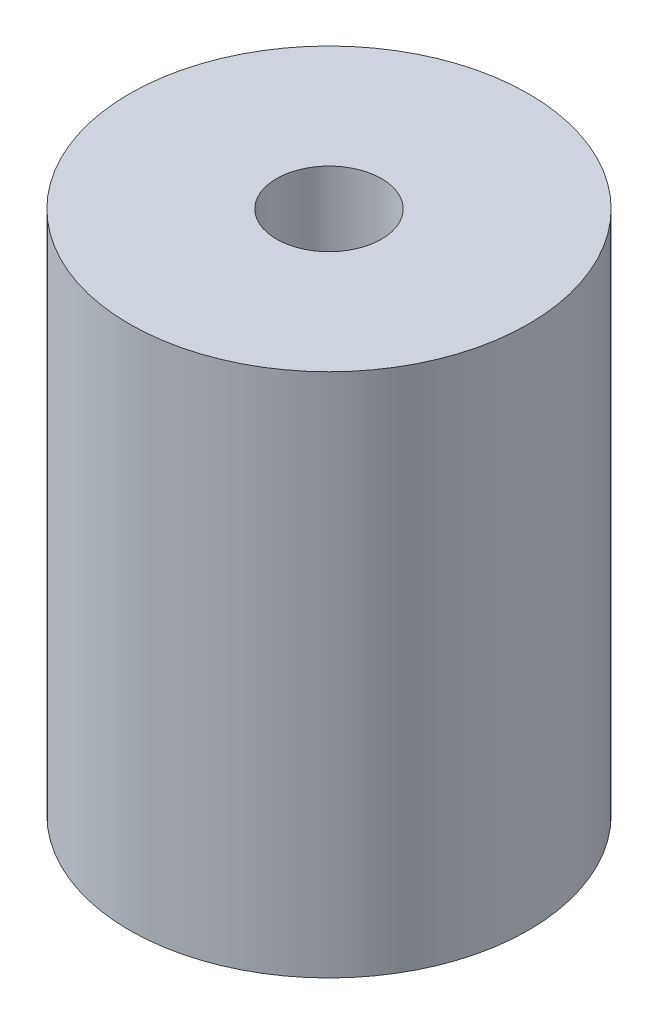
ISO-10303-21;
HEADER;
FILE_DESCRIPTION(('STEP AP214'),'2;1');
FILE_NAME('part.step','',(''),(''),'','','');
FILE_SCHEMA(('AUTOMOTIVE_DESIGN { 1 0 10303 214 1 1 1 1 }'));
ENDSEC;
DATA;
#1=APPLICATION_CONTEXT('core data for automotive mechanical design processes');
#2=APPLICATION_PROTOCOL_DEFINITION('international standard','automotive_design',2000,#1);
#3=PRODUCT_CONTEXT('',#1,'mechanical');
#4=PRODUCT('Part','Part','',(#3));
#5=PRODUCT_RELATED_PRODUCT_CATEGORY('part','',(#4));
#6=PRODUCT_DEFINITION_FORMATION('','',#4);
#7=PRODUCT_DEFINITION_CONTEXT('part definition',#1,'design');
#8=PRODUCT_DEFINITION('design','',#6,#7);
#9=PRODUCT_DEFINITION_SHAPE('','',#8);
#10=(LENGTH_UNIT() NAMED_UNIT(*) SI_UNIT(.MILLI.,.METRE.));
#11=(NAMED_UNIT(*) PLANE_ANGLE_UNIT() SI_UNIT($,.RADIAN.));
#12=(NAMED_UNIT(*) SI_UNIT($,.STERADIAN.) SOLID_ANGLE_UNIT());
#13=UNCERTAINTY_MEASURE_WITH_UNIT(LENGTH_MEASURE(1.E-05),#10,'distance_accuracy_value','');
#14=(GEOMETRIC_REPRESENTATION_CONTEXT(3) GLOBAL_UNCERTAINTY_ASSIGNED_CONTEXT((#13)) GLOBAL_UNIT_ASSIGNED_CONTEXT((#10,
#11,#12)) REPRESENTATION_CONTEXT('',''));
#15=CARTESIAN_POINT('',(0.,0.,0.));
#16=DIRECTION('',(0.,0.,1.));
#17=DIRECTION('',(1.,0.,0.));
#18=AXIS2_PLACEMENT_3D('',#15,#16,#17);
#19=CARTESIAN_POINT('',(9.5,0.,0.));
#20=DIRECTION('',(0.,-1.,0.));
#21=DIRECTION('',(0.,0.,-1.));
#22=AXIS2_PLACEMENT_3D('',#19,#20,#21);
#23=PLANE('',#22);
#24=CARTESIAN_POINT('',(0.,0.,0.));
#25=DIRECTION('',(0.,-1.,0.));
#26=DIRECTION('',(0.,0.,-1.));
#27=AXIS2_PLACEMENT_3D('',#24,#25,#26);
#28=CIRCLE('',#27,9.5);
#29=CARTESIAN_POINT('',(0.,0.,-9.5));
#30=VERTEX_POINT('',#29);
#31=EDGE_CURVE('E54',#30,#30,#28,.T.);
#32=ORIENTED_EDGE('',*,*,#31,.T.);
#33=EDGE_LOOP('',(#32));
#34=FACE_BOUND('',#33,.T.);
#35=CARTESIAN_POINT('',(0.,0.,0.));
#36=DIRECTION('',(0.,-1.,0.));
#37=DIRECTION('',(0.,0.,-1.));
#38=AXIS2_PLACEMENT_3D('',#35,#36,#37);
#39=CIRCLE('',#38,2.5);
#40=CARTESIAN_POINT('',(0.,0.,-2.5));
#41=VERTEX_POINT('',#40);
#42=EDGE_CURVE('E10',#41,#41,#39,.T.);
#43=ORIENTED_EDGE('',*,*,#42,.F.);
#44=EDGE_LOOP('',(#43));
#45=FACE_BOUND('',#44,.T.);
#46=ADVANCED_FACE('F37',(#34,#45),#23,.T.);
#47=CARTESIAN_POINT('',(0.,0.,0.));
#48=DIRECTION('',(0.,-1.,0.));
#49=DIRECTION('',(0.,0.,-1.));
#50=AXIS2_PLACEMENT_3D('',#47,#48,#49);
#51=CYLINDRICAL_SURFACE('',#50,2.5);
#52=ORIENTED_EDGE('',*,*,#42,.T.);
#53=EDGE_LOOP('',(#52));
#54=FACE_BOUND('',#53,.T.);
#55=CARTESIAN_POINT('',(0.,25.,0.));
#56=DIRECTION('',(0.,-1.,0.));
#57=DIRECTION('',(0.,0.,-1.));
#58=AXIS2_PLACEMENT_3D('',#55,#56,#57);
#59=CIRCLE('',#58,2.5);
#60=CARTESIAN_POINT('',(0.,25.,-2.5));
#61=VERTEX_POINT('',#60);
#62=EDGE_CURVE('E44',#61,#61,#59,.T.);
#63=ORIENTED_EDGE('',*,*,#62,.F.);
#64=EDGE_LOOP('',(#63));
#65=FACE_BOUND('',#64,.T.);
#66=ADVANCED_FACE('F71',(#54,#65),#51,.F.);
#67=CARTESIAN_POINT('',(2.5,25.,0.));
#68=DIRECTION('',(0.,1.,0.));
#69=DIRECTION('',(0.,0.,1.));
#70=AXIS2_PLACEMENT_3D('',#67,#68,#69);
#71=PLANE('',#70);
#72=ORIENTED_EDGE('',*,*,#62,.T.);
#73=EDGE_LOOP('',(#72));
#74=FACE_BOUND('',#73,.T.);
#75=CARTESIAN_POINT('',(0.,25.,0.));
#76=DIRECTION('',(0.,-1.,0.));
#77=DIRECTION('',(0.,0.,-1.));
#78=AXIS2_PLACEMENT_3D('',#75,#76,#77);
#79=CIRCLE('',#78,9.5);
#80=CARTESIAN_POINT('',(0.,25.,-9.5));
#81=VERTEX_POINT('',#80);
#82=EDGE_CURVE('E49',#81,#81,#79,.T.);
#83=ORIENTED_EDGE('',*,*,#82,.F.);
#84=EDGE_LOOP('',(#83));
#85=FACE_BOUND('',#84,.T.);
#86=ADVANCED_FACE('F65',(#74,#85),#71,.T.);
#87=CARTESIAN_POINT('',(0.,0.,0.));
#88=DIRECTION('',(0.,-1.,0.));
#89=DIRECTION('',(0.,0.,-1.));
#90=AXIS2_PLACEMENT_3D('',#87,#88,#89);
#91=CYLINDRICAL_SURFACE('',#90,9.5);
#92=ORIENTED_EDGE('',*,*,#82,.T.);
#93=EDGE_LOOP('',(#92));
#94=FACE_BOUND('',#93,.T.);
#95=ORIENTED_EDGE('',*,*,#31,.F.);
#96=EDGE_LOOP('',(#95));
#97=FACE_BOUND('',#96,.T.);
#98=ADVANCED_FACE('F63',(#94,#97),#91,.T.);
#99=CLOSED_SHELL('',(#46,#66,#86,#98));
#100=MANIFOLD_SOLID_BREP('B2',#99);
#101=ADVANCED_BREP_SHAPE_REPRESENTATION('',(#18,#100),#14);
#102=SHAPE_DEFINITION_REPRESENTATION(#9,#101);
ENDSEC;
END-ISO-10303-21;
